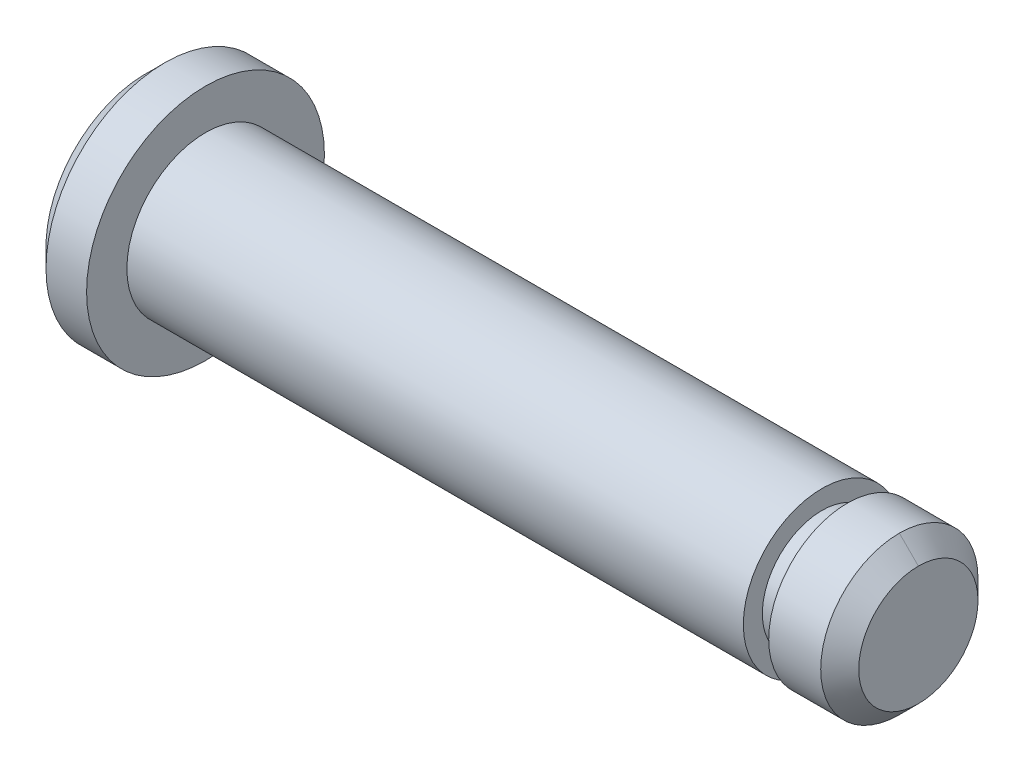
ISO-10303-21;
HEADER;
FILE_DESCRIPTION(('STEP AP214'),'2;1');
FILE_NAME('part.step','',(''),(''),'','','');
FILE_SCHEMA(('AUTOMOTIVE_DESIGN { 1 0 10303 214 1 1 1 1 }'));
ENDSEC;
DATA;
#1=APPLICATION_CONTEXT('core data for automotive mechanical design processes');
#2=APPLICATION_PROTOCOL_DEFINITION('international standard','automotive_design',2000,#1);
#3=PRODUCT_CONTEXT('',#1,'mechanical');
#4=PRODUCT('Part','Part','',(#3));
#5=PRODUCT_RELATED_PRODUCT_CATEGORY('part','',(#4));
#6=PRODUCT_DEFINITION_FORMATION('','',#4);
#7=PRODUCT_DEFINITION_CONTEXT('part definition',#1,'design');
#8=PRODUCT_DEFINITION('design','',#6,#7);
#9=PRODUCT_DEFINITION_SHAPE('','',#8);
#10=(LENGTH_UNIT() NAMED_UNIT(*) SI_UNIT(.MILLI.,.METRE.));
#11=(NAMED_UNIT(*) PLANE_ANGLE_UNIT() SI_UNIT($,.RADIAN.));
#12=(NAMED_UNIT(*) SI_UNIT($,.STERADIAN.) SOLID_ANGLE_UNIT());
#13=UNCERTAINTY_MEASURE_WITH_UNIT(LENGTH_MEASURE(1.E-05),#10,'distance_accuracy_value','');
#14=(GEOMETRIC_REPRESENTATION_CONTEXT(3) GLOBAL_UNCERTAINTY_ASSIGNED_CONTEXT((#13)) GLOBAL_UNIT_ASSIGNED_CONTEXT((#10,
#11,#12)) REPRESENTATION_CONTEXT('',''));
#15=CARTESIAN_POINT('',(0.,0.,0.));
#16=DIRECTION('',(0.,0.,1.));
#17=DIRECTION('',(1.,0.,0.));
#18=AXIS2_PLACEMENT_3D('',#15,#16,#17);
#19=CARTESIAN_POINT('',(8.14831999999996,24.6152251576294,7.6704800283793));
#20=DIRECTION('',(1.,0.,0.));
#21=DIRECTION('',(0.,0.,-1.));
#22=AXIS2_PLACEMENT_3D('',#19,#20,#21);
#23=PLANE('',#22);
#24=CARTESIAN_POINT('',(8.14831999991839,24.6152251576294,7.6704800283793));
#25=DIRECTION('',(-1.,0.,0.));
#26=DIRECTION('',(0.,0.,1.));
#27=AXIS2_PLACEMENT_3D('',#24,#25,#26);
#28=CIRCLE('',#27,1.19380000005516);
#29=CARTESIAN_POINT('',(8.14831999991839,23.4214251575684,7.67048002837931));
#30=VERTEX_POINT('',#29);
#31=CARTESIAN_POINT('',(8.14831999991839,25.8090251576904,7.6704800283793));
#32=VERTEX_POINT('',#31);
#33=EDGE_CURVE('E48',#30,#32,#28,.T.);
#34=ORIENTED_EDGE('',*,*,#33,.F.);
#35=CARTESIAN_POINT('',(8.14831999991839,24.6152251576294,7.6704800283793));
#36=DIRECTION('',(-1.,0.,0.));
#37=DIRECTION('',(0.,0.,1.));
#38=AXIS2_PLACEMENT_3D('',#35,#36,#37);
#39=CIRCLE('',#38,1.19380000005516);
#40=EDGE_CURVE('E20',#32,#30,#39,.T.);
#41=ORIENTED_EDGE('',*,*,#40,.F.);
#42=EDGE_LOOP('',(#34,#41));
#43=FACE_BOUND('',#42,.T.);
#44=ADVANCED_FACE('F17',(#43),#23,.T.);
#45=CARTESIAN_POINT('',(7.76731999997082,24.6152251576294,7.6704800283793));
#46=DIRECTION('',(-1.,0.,0.));
#47=DIRECTION('',(0.,0.,1.));
#48=AXIS2_PLACEMENT_3D('',#45,#46,#47);
#49=CONICAL_SURFACE('',#48,1.57480000005956,0.785398163472046);
#50=DIRECTION('',(0.707106781186548,0.707106781186547,0.));
#51=VECTOR('',#50,1.);
#52=CARTESIAN_POINT('',(-498966.042654843,-498950.769549685,7.67048002952396));
#53=LINE('',#52,#51);
#54=CARTESIAN_POINT('',(7.76731999999267,23.0404251576087,7.67048002837931));
#55=VERTEX_POINT('',#54);
#56=EDGE_CURVE('E45',#55,#30,#53,.T.);
#57=ORIENTED_EDGE('',*,*,#56,.F.);
#58=CARTESIAN_POINT('',(7.76731999999996,24.6152251576294,7.6704800283793));
#59=DIRECTION('',(-1.,0.,0.));
#60=DIRECTION('',(0.,0.,1.));
#61=AXIS2_PLACEMENT_3D('',#58,#59,#60);
#62=CIRCLE('',#61,1.5748);
#63=CARTESIAN_POINT('',(7.76732000000688,26.1900251576159,7.6704800283793));
#64=VERTEX_POINT('',#63);
#65=EDGE_CURVE('E35',#64,#55,#62,.T.);
#66=ORIENTED_EDGE('',*,*,#65,.F.);
#67=DIRECTION('',(0.707106781186548,-0.707106781186547,0.));
#68=VECTOR('',#67,1.);
#69=CARTESIAN_POINT('',(-498966.042654843,499000.,7.67048002673036));
#70=LINE('',#69,#68);
#71=EDGE_CURVE('E46',#32,#64,#70,.F.);
#72=ORIENTED_EDGE('',*,*,#71,.F.);
#73=ORIENTED_EDGE('',*,*,#40,.T.);
#74=EDGE_LOOP('',(#57,#66,#72,#73));
#75=FACE_BOUND('',#74,.T.);
#76=ADVANCED_FACE('F43',(#75),#49,.T.);
#77=CARTESIAN_POINT('',(7.76732000002767,24.6152251576294,7.6704800283793));
#78=DIRECTION('',(-1.,0.,0.));
#79=DIRECTION('',(0.,0.,1.));
#80=AXIS2_PLACEMENT_3D('',#77,#78,#79);
#81=CONICAL_SURFACE('',#80,1.57479999994587,0.785398163397448);
#82=ORIENTED_EDGE('',*,*,#56,.T.);
#83=ORIENTED_EDGE('',*,*,#33,.T.);
#84=ORIENTED_EDGE('',*,*,#71,.T.);
#85=CARTESIAN_POINT('',(7.76731999999996,24.6152251576294,7.6704800283793));
#86=DIRECTION('',(-1.,0.,0.));
#87=DIRECTION('',(0.,0.,1.));
#88=AXIS2_PLACEMENT_3D('',#85,#86,#87);
#89=CIRCLE('',#88,1.5748);
#90=EDGE_CURVE('E53',#55,#64,#89,.T.);
#91=ORIENTED_EDGE('',*,*,#90,.F.);
#92=EDGE_LOOP('',(#82,#83,#84,#91));
#93=FACE_BOUND('',#92,.T.);
#94=ADVANCED_FACE('F51',(#93),#81,.T.);
#95=CARTESIAN_POINT('',(1.01091999999996,24.6152251576294,7.6704800283793));
#96=DIRECTION('',(-1.,0.,0.));
#97=DIRECTION('',(0.,0.,1.));
#98=AXIS2_PLACEMENT_3D('',#95,#96,#97);
#99=CYLINDRICAL_SURFACE('',#98,1.5748);
#100=ORIENTED_EDGE('',*,*,#65,.T.);
#101=ORIENTED_EDGE('',*,*,#90,.T.);
#102=EDGE_LOOP('',(#100,#101));
#103=FACE_BOUND('',#102,.T.);
#104=CARTESIAN_POINT('',(6.72591999999995,24.6152251576294,7.6704800283793));
#105=DIRECTION('',(-1.,0.,0.));
#106=DIRECTION('',(0.,0.,1.));
#107=AXIS2_PLACEMENT_3D('',#104,#105,#106);
#108=CIRCLE('',#107,1.5748);
#109=CARTESIAN_POINT('',(6.72591999999995,24.6152251576294,9.2452800283793));
#110=VERTEX_POINT('',#109);
#111=EDGE_CURVE('E76',#110,#110,#108,.F.);
#112=ORIENTED_EDGE('',*,*,#111,.T.);
#113=EDGE_LOOP('',(#112));
#114=FACE_BOUND('',#113,.T.);
#115=ADVANCED_FACE('F202',(#103,#114),#99,.T.);
#116=CARTESIAN_POINT('',(-7.32028000000005,24.6152251576294,7.6704800283793));
#117=DIRECTION('',(-1.,0.,0.));
#118=DIRECTION('',(0.,-1.,0.));
#119=AXIS2_PLACEMENT_3D('',#116,#117,#118);
#120=PLANE('',#119);
#121=CARTESIAN_POINT('',(-7.32027999998763,24.6152251576294,7.6704800283793));
#122=DIRECTION('',(1.,0.,0.));
#123=DIRECTION('',(0.,0.,-1.));
#124=AXIS2_PLACEMENT_3D('',#121,#122,#123);
#125=CIRCLE('',#124,2.0002499999922);
#126=CARTESIAN_POINT('',(-7.32027999998763,24.6152251576294,5.6702300283871));
#127=VERTEX_POINT('',#126);
#128=EDGE_CURVE('E73',#127,#127,#125,.T.);
#129=ORIENTED_EDGE('',*,*,#128,.F.);
#130=EDGE_LOOP('',(#129));
#131=FACE_BOUND('',#130,.T.);
#132=ADVANCED_FACE('F105',(#131),#120,.T.);
#133=CARTESIAN_POINT('',(6.72591999999995,24.6152251576294,7.6704800283793));
#134=DIRECTION('',(1.,0.,0.));
#135=DIRECTION('',(0.,0.,-1.));
#136=AXIS2_PLACEMENT_3D('',#133,#134,#135);
#137=PLANE('',#136);
#138=CARTESIAN_POINT('',(6.72591999999995,24.6152251576294,7.6704800283793));
#139=DIRECTION('',(1.,0.,0.));
#140=DIRECTION('',(0.,0.,-1.));
#141=AXIS2_PLACEMENT_3D('',#138,#139,#140);
#142=CIRCLE('',#141,1.1938);
#143=CARTESIAN_POINT('',(6.72591999999995,24.6152251576294,6.4766800283793));
#144=VERTEX_POINT('',#143);
#145=EDGE_CURVE('E70',#144,#144,#142,.F.);
#146=ORIENTED_EDGE('',*,*,#145,.F.);
#147=EDGE_LOOP('',(#146));
#148=FACE_BOUND('',#147,.T.);
#149=ORIENTED_EDGE('',*,*,#111,.F.);
#150=EDGE_LOOP('',(#149));
#151=FACE_BOUND('',#150,.T.);
#152=ADVANCED_FACE('F96',(#148,#151),#137,.F.);
#153=CARTESIAN_POINT('',(-6.93928000009691,24.6152251576294,7.6704800283793));
#154=DIRECTION('',(1.,0.,0.));
#155=DIRECTION('',(0.,0.,-1.));
#156=AXIS2_PLACEMENT_3D('',#153,#154,#155);
#157=CONICAL_SURFACE('',#156,2.38124999988292,0.785398163397448);
#158=ORIENTED_EDGE('',*,*,#128,.T.);
#159=EDGE_LOOP('',(#158));
#160=FACE_BOUND('',#159,.T.);
#161=CARTESIAN_POINT('',(-6.93928000000005,24.6152251576294,7.6704800283793));
#162=DIRECTION('',(1.,0.,0.));
#163=DIRECTION('',(0.,0.,-1.));
#164=AXIS2_PLACEMENT_3D('',#161,#162,#163);
#165=CIRCLE('',#164,2.38125);
#166=CARTESIAN_POINT('',(-6.93928000000005,24.6152251576294,5.2892300283793));
#167=VERTEX_POINT('',#166);
#168=EDGE_CURVE('E69',#167,#167,#165,.T.);
#169=ORIENTED_EDGE('',*,*,#168,.F.);
#170=EDGE_LOOP('',(#169));
#171=FACE_BOUND('',#170,.T.);
#172=ADVANCED_FACE('F93',(#160,#171),#157,.T.);
#173=CARTESIAN_POINT('',(6.47191999999995,24.6152251576294,7.6704800283793));
#174=DIRECTION('',(1.,0.,0.));
#175=DIRECTION('',(0.,0.,-1.));
#176=AXIS2_PLACEMENT_3D('',#173,#174,#175);
#177=CYLINDRICAL_SURFACE('',#176,1.1938);
#178=CARTESIAN_POINT('',(6.21791999999995,24.6152251576294,7.6704800283793));
#179=DIRECTION('',(1.,0.,0.));
#180=DIRECTION('',(0.,0.,-1.));
#181=AXIS2_PLACEMENT_3D('',#178,#179,#180);
#182=CIRCLE('',#181,1.1938);
#183=CARTESIAN_POINT('',(6.21791999999995,24.6152251576294,6.4766800283793));
#184=VERTEX_POINT('',#183);
#185=EDGE_CURVE('E66',#184,#184,#182,.T.);
#186=ORIENTED_EDGE('',*,*,#185,.T.);
#187=EDGE_LOOP('',(#186));
#188=FACE_BOUND('',#187,.T.);
#189=ORIENTED_EDGE('',*,*,#145,.T.);
#190=EDGE_LOOP('',(#189));
#191=FACE_BOUND('',#190,.T.);
#192=ADVANCED_FACE('F95',(#188,#191),#177,.T.);
#193=CARTESIAN_POINT('',(-6.72338000000004,24.6152251576294,7.6704800283793));
#194=DIRECTION('',(1.,0.,0.));
#195=DIRECTION('',(0.,0.,-1.));
#196=AXIS2_PLACEMENT_3D('',#193,#194,#195);
#197=CYLINDRICAL_SURFACE('',#196,2.38125);
#198=CARTESIAN_POINT('',(-6.12648000000004,24.6152251576294,7.6704800283793));
#199=DIRECTION('',(1.,0.,0.));
#200=DIRECTION('',(0.,0.,-1.));
#201=AXIS2_PLACEMENT_3D('',#198,#199,#200);
#202=CIRCLE('',#201,2.38125);
#203=CARTESIAN_POINT('',(-6.12648000000004,24.6152251576294,5.2892300283793));
#204=VERTEX_POINT('',#203);
#205=EDGE_CURVE('E63',#204,#204,#202,.T.);
#206=ORIENTED_EDGE('',*,*,#205,.F.);
#207=EDGE_LOOP('',(#206));
#208=FACE_BOUND('',#207,.T.);
#209=ORIENTED_EDGE('',*,*,#168,.T.);
#210=EDGE_LOOP('',(#209));
#211=FACE_BOUND('',#210,.T.);
#212=ADVANCED_FACE('F91',(#208,#211),#197,.T.);
#213=CARTESIAN_POINT('',(6.21791999999995,24.6152251576294,7.6704800283793));
#214=DIRECTION('',(-1.,0.,0.));
#215=DIRECTION('',(0.,0.,1.));
#216=AXIS2_PLACEMENT_3D('',#213,#214,#215);
#217=PLANE('',#216);
#218=ORIENTED_EDGE('',*,*,#185,.F.);
#219=EDGE_LOOP('',(#218));
#220=FACE_BOUND('',#219,.T.);
#221=CARTESIAN_POINT('',(6.21791999999995,24.6152251576294,7.6704800283793));
#222=DIRECTION('',(-1.,0.,0.));
#223=DIRECTION('',(0.,0.,1.));
#224=AXIS2_PLACEMENT_3D('',#221,#222,#223);
#225=CIRCLE('',#224,1.5748);
#226=CARTESIAN_POINT('',(6.21791999999995,24.6152251576294,9.2452800283793));
#227=VERTEX_POINT('',#226);
#228=EDGE_CURVE('E26',#227,#227,#225,.T.);
#229=ORIENTED_EDGE('',*,*,#228,.F.);
#230=EDGE_LOOP('',(#229));
#231=FACE_BOUND('',#230,.T.);
#232=ADVANCED_FACE('F115',(#220,#231),#217,.F.);
#233=CARTESIAN_POINT('',(-6.12648000000004,24.6152251576294,7.6704800283793));
#234=DIRECTION('',(1.,0.,0.));
#235=DIRECTION('',(0.,0.,-1.));
#236=AXIS2_PLACEMENT_3D('',#233,#234,#235);
#237=PLANE('',#236);
#238=CARTESIAN_POINT('',(-6.12648000000004,24.6152251576294,7.6704800283793));
#239=DIRECTION('',(-1.,0.,0.));
#240=DIRECTION('',(0.,0.,1.));
#241=AXIS2_PLACEMENT_3D('',#238,#239,#240);
#242=CIRCLE('',#241,1.5748);
#243=CARTESIAN_POINT('',(-6.12648000000004,24.6152251576294,9.2452800283793));
#244=VERTEX_POINT('',#243);
#245=EDGE_CURVE('E11',#244,#244,#242,.F.);
#246=ORIENTED_EDGE('',*,*,#245,.F.);
#247=EDGE_LOOP('',(#246));
#248=FACE_BOUND('',#247,.T.);
#249=ORIENTED_EDGE('',*,*,#205,.T.);
#250=EDGE_LOOP('',(#249));
#251=FACE_BOUND('',#250,.T.);
#252=ADVANCED_FACE('F110',(#248,#251),#237,.T.);
#253=CARTESIAN_POINT('',(1.01091999999996,24.6152251576294,7.6704800283793));
#254=DIRECTION('',(-1.,0.,0.));
#255=DIRECTION('',(0.,0.,1.));
#256=AXIS2_PLACEMENT_3D('',#253,#254,#255);
#257=CYLINDRICAL_SURFACE('',#256,1.5748);
#258=ORIENTED_EDGE('',*,*,#228,.T.);
#259=EDGE_LOOP('',(#258));
#260=FACE_BOUND('',#259,.T.);
#261=ORIENTED_EDGE('',*,*,#245,.T.);
#262=EDGE_LOOP('',(#261));
#263=FACE_BOUND('',#262,.T.);
#264=ADVANCED_FACE('F108',(#260,#263),#257,.T.);
#265=CLOSED_SHELL('',(#44,#76,#94,#115,#132,#152,#172,#192,#212,#232,#252,#264));
#266=MANIFOLD_SOLID_BREP('B1',#265);
#267=ADVANCED_BREP_SHAPE_REPRESENTATION('',(#18,#266),#14);
#268=SHAPE_DEFINITION_REPRESENTATION(#9,#267);
ENDSEC;
END-ISO-10303-21;
